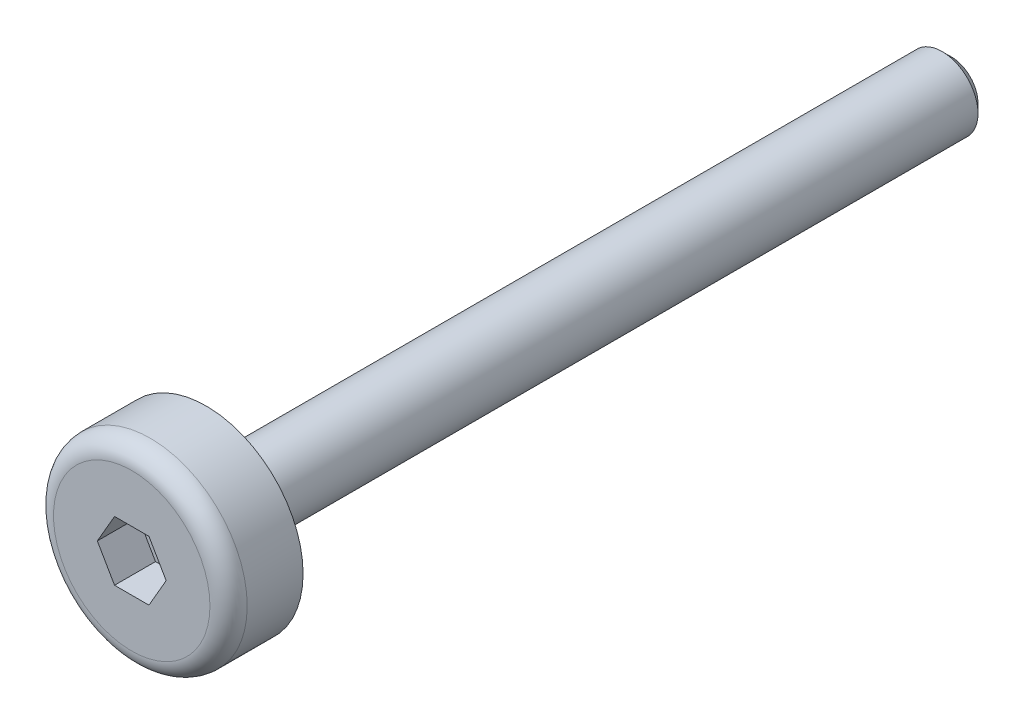
ISO-10303-21;
HEADER;
FILE_DESCRIPTION(('STEP AP214'),'2;1');
FILE_NAME('part.step','',(''),(''),'','','');
FILE_SCHEMA(('AUTOMOTIVE_DESIGN { 1 0 10303 214 1 1 1 1 }'));
ENDSEC;
DATA;
#1=APPLICATION_CONTEXT('core data for automotive mechanical design processes');
#2=APPLICATION_PROTOCOL_DEFINITION('international standard','automotive_design',2000,#1);
#3=PRODUCT_CONTEXT('',#1,'mechanical');
#4=PRODUCT('Part','Part','',(#3));
#5=PRODUCT_RELATED_PRODUCT_CATEGORY('part','',(#4));
#6=PRODUCT_DEFINITION_FORMATION('','',#4);
#7=PRODUCT_DEFINITION_CONTEXT('part definition',#1,'design');
#8=PRODUCT_DEFINITION('design','',#6,#7);
#9=PRODUCT_DEFINITION_SHAPE('','',#8);
#10=(LENGTH_UNIT() NAMED_UNIT(*) SI_UNIT(.MILLI.,.METRE.));
#11=(NAMED_UNIT(*) PLANE_ANGLE_UNIT() SI_UNIT($,.RADIAN.));
#12=(NAMED_UNIT(*) SI_UNIT($,.STERADIAN.) SOLID_ANGLE_UNIT());
#13=UNCERTAINTY_MEASURE_WITH_UNIT(LENGTH_MEASURE(1.E-05),#10,'distance_accuracy_value','');
#14=(GEOMETRIC_REPRESENTATION_CONTEXT(3) GLOBAL_UNCERTAINTY_ASSIGNED_CONTEXT((#13)) GLOBAL_UNIT_ASSIGNED_CONTEXT((#10,
#11,#12)) REPRESENTATION_CONTEXT('',''));
#15=CARTESIAN_POINT('',(0.,0.,0.));
#16=DIRECTION('',(0.,0.,1.));
#17=DIRECTION('',(1.,0.,0.));
#18=AXIS2_PLACEMENT_3D('',#15,#16,#17);
#19=CARTESIAN_POINT('',(0.,0.,-25.));
#20=DIRECTION('',(0.,0.,-1.));
#21=DIRECTION('',(-1.,0.,0.));
#22=AXIS2_PLACEMENT_3D('',#19,#20,#21);
#23=PLANE('',#22);
#24=CARTESIAN_POINT('',(0.,0.,-25.));
#25=DIRECTION('',(0.,0.,-1.));
#26=DIRECTION('',(-1.,0.,0.));
#27=AXIS2_PLACEMENT_3D('',#24,#25,#26);
#28=CIRCLE('',#27,0.900000000000008);
#29=CARTESIAN_POINT('',(-0.900000000000008,0.,-25.));
#30=VERTEX_POINT('',#29);
#31=EDGE_CURVE('E156',#30,#30,#28,.T.);
#32=ORIENTED_EDGE('',*,*,#31,.T.);
#33=EDGE_LOOP('',(#32));
#34=FACE_BOUND('',#33,.T.);
#35=ADVANCED_FACE('F40',(#34),#23,.T.);
#36=CARTESIAN_POINT('',(0.,0.,10.123));
#37=DIRECTION('',(0.,0.,1.));
#38=DIRECTION('',(1.,0.,0.));
#39=AXIS2_PLACEMENT_3D('',#36,#37,#38);
#40=CYLINDRICAL_SURFACE('',#39,1.2);
#41=CARTESIAN_POINT('',(0.,0.,-24.7));
#42=DIRECTION('',(0.,0.,-1.));
#43=DIRECTION('',(-1.,0.,0.));
#44=AXIS2_PLACEMENT_3D('',#41,#42,#43);
#45=CIRCLE('',#44,1.2);
#46=CARTESIAN_POINT('',(-1.2,0.,-24.7));
#47=VERTEX_POINT('',#46);
#48=EDGE_CURVE('E153',#47,#47,#45,.F.);
#49=ORIENTED_EDGE('',*,*,#48,.T.);
#50=EDGE_LOOP('',(#49));
#51=FACE_BOUND('',#50,.T.);
#52=CARTESIAN_POINT('',(0.,0.,0.));
#53=DIRECTION('',(0.,0.,1.));
#54=DIRECTION('',(1.,0.,0.));
#55=AXIS2_PLACEMENT_3D('',#52,#53,#54);
#56=CIRCLE('',#55,1.2);
#57=CARTESIAN_POINT('',(1.2,0.,0.));
#58=VERTEX_POINT('',#57);
#59=EDGE_CURVE('E150',#58,#58,#56,.T.);
#60=ORIENTED_EDGE('',*,*,#59,.F.);
#61=EDGE_LOOP('',(#60));
#62=FACE_BOUND('',#61,.T.);
#63=ADVANCED_FACE('F176',(#51,#62),#40,.T.);
#64=CARTESIAN_POINT('',(1.2,0.,0.));
#65=DIRECTION('',(0.,0.,-1.));
#66=DIRECTION('',(-1.,0.,0.));
#67=AXIS2_PLACEMENT_3D('',#64,#65,#66);
#68=PLANE('',#67);
#69=ORIENTED_EDGE('',*,*,#59,.T.);
#70=EDGE_LOOP('',(#69));
#71=FACE_BOUND('',#70,.T.);
#72=CARTESIAN_POINT('',(0.,0.,0.));
#73=DIRECTION('',(0.,0.,1.));
#74=DIRECTION('',(1.,0.,0.));
#75=AXIS2_PLACEMENT_3D('',#72,#73,#74);
#76=CIRCLE('',#75,3.25);
#77=CARTESIAN_POINT('',(3.25,0.,0.));
#78=VERTEX_POINT('',#77);
#79=EDGE_CURVE('E142',#78,#78,#76,.T.);
#80=ORIENTED_EDGE('',*,*,#79,.F.);
#81=EDGE_LOOP('',(#80));
#82=FACE_BOUND('',#81,.T.);
#83=ADVANCED_FACE('F182',(#71,#82),#68,.T.);
#84=CARTESIAN_POINT('',(0.,0.,10.123));
#85=DIRECTION('',(0.,0.,1.));
#86=DIRECTION('',(1.,0.,0.));
#87=AXIS2_PLACEMENT_3D('',#84,#85,#86);
#88=CYLINDRICAL_SURFACE('',#87,3.25);
#89=CARTESIAN_POINT('',(0.,0.,1.875));
#90=DIRECTION('',(0.,0.,1.));
#91=DIRECTION('',(1.,0.,0.));
#92=AXIS2_PLACEMENT_3D('',#89,#90,#91);
#93=CIRCLE('',#92,3.25);
#94=CARTESIAN_POINT('',(3.25,0.,1.875));
#95=VERTEX_POINT('',#94);
#96=EDGE_CURVE('E11',#95,#95,#93,.F.);
#97=ORIENTED_EDGE('',*,*,#96,.T.);
#98=EDGE_LOOP('',(#97));
#99=FACE_BOUND('',#98,.T.);
#100=ORIENTED_EDGE('',*,*,#79,.T.);
#101=EDGE_LOOP('',(#100));
#102=FACE_BOUND('',#101,.T.);
#103=ADVANCED_FACE('F191',(#99,#102),#88,.T.);
#104=CARTESIAN_POINT('',(3.25,0.,2.5));
#105=DIRECTION('',(0.,0.,1.));
#106=DIRECTION('',(1.,0.,0.));
#107=AXIS2_PLACEMENT_3D('',#104,#105,#106);
#108=PLANE('',#107);
#109=DIRECTION('',(0.499999999999995,0.866025403784441,0.));
#110=VECTOR('',#109,1.);
#111=CARTESIAN_POINT('',(0.577350269189637,-0.999999999999993,2.5));
#112=LINE('',#111,#110);
#113=CARTESIAN_POINT('',(0.577350269189637,-0.999999999999993,2.5));
#114=VERTEX_POINT('',#113);
#115=CARTESIAN_POINT('',(1.15470053837925,0.,2.5));
#116=VERTEX_POINT('',#115);
#117=EDGE_CURVE('E55',#114,#116,#112,.T.);
#118=ORIENTED_EDGE('',*,*,#117,.F.);
#119=DIRECTION('',(1.,0.,0.));
#120=VECTOR('',#119,1.);
#121=CARTESIAN_POINT('',(-0.577350269189617,-1.00000000000001,2.5));
#122=LINE('',#121,#120);
#123=CARTESIAN_POINT('',(-0.577350269189617,-1.00000000000001,2.5));
#124=VERTEX_POINT('',#123);
#125=EDGE_CURVE('E138',#124,#114,#122,.T.);
#126=ORIENTED_EDGE('',*,*,#125,.F.);
#127=DIRECTION('',(0.500000000000007,-0.866025403784434,0.));
#128=VECTOR('',#127,1.);
#129=CARTESIAN_POINT('',(-1.15470053837925,0.,2.5));
#130=LINE('',#129,#128);
#131=CARTESIAN_POINT('',(-1.15470053837925,0.,2.5));
#132=VERTEX_POINT('',#131);
#133=EDGE_CURVE('E136',#132,#124,#130,.T.);
#134=ORIENTED_EDGE('',*,*,#133,.F.);
#135=DIRECTION('',(-0.499999999999995,-0.866025403784442,0.));
#136=VECTOR('',#135,1.);
#137=CARTESIAN_POINT('',(-0.57735026918963,0.999999999999998,2.5));
#138=LINE('',#137,#136);
#139=CARTESIAN_POINT('',(-0.57735026918963,0.999999999999998,2.5));
#140=VERTEX_POINT('',#139);
#141=EDGE_CURVE('E103',#140,#132,#138,.T.);
#142=ORIENTED_EDGE('',*,*,#141,.F.);
#143=DIRECTION('',(-1.,0.,0.));
#144=VECTOR('',#143,1.);
#145=CARTESIAN_POINT('',(0.577350269189624,1.,2.5));
#146=LINE('',#145,#144);
#147=CARTESIAN_POINT('',(0.577350269189624,1.,2.5));
#148=VERTEX_POINT('',#147);
#149=EDGE_CURVE('E132',#148,#140,#146,.T.);
#150=ORIENTED_EDGE('',*,*,#149,.F.);
#151=DIRECTION('',(-0.500000000000001,0.866025403784438,0.));
#152=VECTOR('',#151,1.);
#153=CARTESIAN_POINT('',(1.15470053837925,0.,2.5));
#154=LINE('',#153,#152);
#155=EDGE_CURVE('E129',#116,#148,#154,.T.);
#156=ORIENTED_EDGE('',*,*,#155,.F.);
#157=EDGE_LOOP('',(#118,#126,#134,#142,#150,#156));
#158=FACE_BOUND('',#157,.T.);
#159=CARTESIAN_POINT('',(0.,0.,2.5));
#160=DIRECTION('',(0.,0.,1.));
#161=DIRECTION('',(1.,0.,0.));
#162=AXIS2_PLACEMENT_3D('',#159,#160,#161);
#163=CIRCLE('',#162,2.625);
#164=CARTESIAN_POINT('',(2.625,0.,2.5));
#165=VERTEX_POINT('',#164);
#166=EDGE_CURVE('E48',#165,#165,#163,.T.);
#167=ORIENTED_EDGE('',*,*,#166,.T.);
#168=EDGE_LOOP('',(#167));
#169=FACE_BOUND('',#168,.T.);
#170=ADVANCED_FACE('F161',(#158,#169),#108,.T.);
#171=CARTESIAN_POINT('',(0.,0.,-24.7));
#172=DIRECTION('',(0.,0.,1.));
#173=DIRECTION('',(1.,0.,0.));
#174=AXIS2_PLACEMENT_3D('',#171,#172,#173);
#175=CONICAL_SURFACE('',#174,1.2,0.785398163397443);
#176=ORIENTED_EDGE('',*,*,#31,.F.);
#177=EDGE_LOOP('',(#176));
#178=FACE_BOUND('',#177,.T.);
#179=ORIENTED_EDGE('',*,*,#48,.F.);
#180=EDGE_LOOP('',(#179));
#181=FACE_BOUND('',#180,.T.);
#182=ADVANCED_FACE('F165',(#178,#181),#175,.T.);
#183=CARTESIAN_POINT('',(0.,0.,1.875));
#184=DIRECTION('',(0.,0.,1.));
#185=DIRECTION('',(1.,0.,0.));
#186=AXIS2_PLACEMENT_3D('',#183,#184,#185);
#187=TOROIDAL_SURFACE('',#186,2.625,0.625);
#188=ORIENTED_EDGE('',*,*,#96,.F.);
#189=EDGE_LOOP('',(#188));
#190=FACE_BOUND('',#189,.T.);
#191=ORIENTED_EDGE('',*,*,#166,.F.);
#192=EDGE_LOOP('',(#191));
#193=FACE_BOUND('',#192,.T.);
#194=ADVANCED_FACE('F42',(#190,#193),#187,.T.);
#195=CARTESIAN_POINT('',(0.577350269189637,-0.999999999999993,1.125));
#196=DIRECTION('',(0.866025403784441,-0.499999999999995,0.));
#197=DIRECTION('',(0.499999999999995,0.866025403784441,0.));
#198=AXIS2_PLACEMENT_3D('',#195,#196,#197);
#199=PLANE('',#198);
#200=ORIENTED_EDGE('',*,*,#117,.T.);
#201=DIRECTION('',(0.,0.,1.));
#202=VECTOR('',#201,1.);
#203=CARTESIAN_POINT('',(1.15470053837925,0.,1.125));
#204=LINE('',#203,#202);
#205=CARTESIAN_POINT('',(1.15470053837925,0.,1.125));
#206=VERTEX_POINT('',#205);
#207=EDGE_CURVE('E85',#206,#116,#204,.T.);
#208=ORIENTED_EDGE('',*,*,#207,.F.);
#209=DIRECTION('',(0.499999999999995,0.866025403784441,0.));
#210=VECTOR('',#209,1.);
#211=CARTESIAN_POINT('',(0.577350269189637,-0.999999999999993,1.125));
#212=LINE('',#211,#210);
#213=CARTESIAN_POINT('',(0.577350269189637,-0.999999999999993,1.125));
#214=VERTEX_POINT('',#213);
#215=EDGE_CURVE('E140',#214,#206,#212,.T.);
#216=ORIENTED_EDGE('',*,*,#215,.F.);
#217=DIRECTION('',(0.,0.,1.));
#218=VECTOR('',#217,1.);
#219=CARTESIAN_POINT('',(0.577350269189637,-0.999999999999993,1.125));
#220=LINE('',#219,#218);
#221=EDGE_CURVE('E63',#214,#114,#220,.T.);
#222=ORIENTED_EDGE('',*,*,#221,.T.);
#223=EDGE_LOOP('',(#200,#208,#216,#222));
#224=FACE_BOUND('',#223,.T.);
#225=ADVANCED_FACE('F164',(#224),#199,.F.);
#226=CARTESIAN_POINT('',(-0.577350269189617,-1.00000000000001,1.125));
#227=DIRECTION('',(0.,-1.,0.));
#228=DIRECTION('',(1.,0.,0.));
#229=AXIS2_PLACEMENT_3D('',#226,#227,#228);
#230=PLANE('',#229);
#231=ORIENTED_EDGE('',*,*,#125,.T.);
#232=ORIENTED_EDGE('',*,*,#221,.F.);
#233=DIRECTION('',(1.,0.,0.));
#234=VECTOR('',#233,1.);
#235=CARTESIAN_POINT('',(-0.577350269189617,-1.00000000000001,1.125));
#236=LINE('',#235,#234);
#237=CARTESIAN_POINT('',(-0.577350269189617,-1.00000000000001,1.125));
#238=VERTEX_POINT('',#237);
#239=EDGE_CURVE('E115',#238,#214,#236,.T.);
#240=ORIENTED_EDGE('',*,*,#239,.F.);
#241=DIRECTION('',(0.,0.,1.));
#242=VECTOR('',#241,1.);
#243=CARTESIAN_POINT('',(-0.577350269189617,-1.00000000000001,1.125));
#244=LINE('',#243,#242);
#245=EDGE_CURVE('E107',#238,#124,#244,.T.);
#246=ORIENTED_EDGE('',*,*,#245,.T.);
#247=EDGE_LOOP('',(#231,#232,#240,#246));
#248=FACE_BOUND('',#247,.T.);
#249=ADVANCED_FACE('F171',(#248),#230,.F.);
#250=CARTESIAN_POINT('',(-1.15470053837925,0.,1.125));
#251=DIRECTION('',(-0.866025403784435,-0.500000000000007,0.));
#252=DIRECTION('',(0.500000000000007,-0.866025403784435,0.));
#253=AXIS2_PLACEMENT_3D('',#250,#251,#252);
#254=PLANE('',#253);
#255=ORIENTED_EDGE('',*,*,#133,.T.);
#256=ORIENTED_EDGE('',*,*,#245,.F.);
#257=DIRECTION('',(0.500000000000007,-0.866025403784434,0.));
#258=VECTOR('',#257,1.);
#259=CARTESIAN_POINT('',(-1.15470053837925,0.,1.125));
#260=LINE('',#259,#258);
#261=CARTESIAN_POINT('',(-1.15470053837925,0.,1.125));
#262=VERTEX_POINT('',#261);
#263=EDGE_CURVE('E111',#262,#238,#260,.T.);
#264=ORIENTED_EDGE('',*,*,#263,.F.);
#265=DIRECTION('',(0.,0.,1.));
#266=VECTOR('',#265,1.);
#267=CARTESIAN_POINT('',(-1.15470053837925,0.,1.125));
#268=LINE('',#267,#266);
#269=EDGE_CURVE('E96',#262,#132,#268,.T.);
#270=ORIENTED_EDGE('',*,*,#269,.T.);
#271=EDGE_LOOP('',(#255,#256,#264,#270));
#272=FACE_BOUND('',#271,.T.);
#273=ADVANCED_FACE('F112',(#272),#254,.F.);
#274=CARTESIAN_POINT('',(-0.57735026918963,0.999999999999998,1.125));
#275=DIRECTION('',(-0.866025403784442,0.499999999999995,0.));
#276=DIRECTION('',(-0.499999999999995,-0.866025403784441,0.));
#277=AXIS2_PLACEMENT_3D('',#274,#275,#276);
#278=PLANE('',#277);
#279=ORIENTED_EDGE('',*,*,#141,.T.);
#280=ORIENTED_EDGE('',*,*,#269,.F.);
#281=DIRECTION('',(-0.499999999999995,-0.866025403784442,0.));
#282=VECTOR('',#281,1.);
#283=CARTESIAN_POINT('',(-0.57735026918963,0.999999999999998,1.125));
#284=LINE('',#283,#282);
#285=CARTESIAN_POINT('',(-0.57735026918963,0.999999999999998,1.125));
#286=VERTEX_POINT('',#285);
#287=EDGE_CURVE('E100',#286,#262,#284,.T.);
#288=ORIENTED_EDGE('',*,*,#287,.F.);
#289=DIRECTION('',(0.,0.,1.));
#290=VECTOR('',#289,1.);
#291=CARTESIAN_POINT('',(-0.57735026918963,0.999999999999998,1.125));
#292=LINE('',#291,#290);
#293=EDGE_CURVE('E108',#286,#140,#292,.T.);
#294=ORIENTED_EDGE('',*,*,#293,.T.);
#295=EDGE_LOOP('',(#279,#280,#288,#294));
#296=FACE_BOUND('',#295,.T.);
#297=ADVANCED_FACE('F98',(#296),#278,.F.);
#298=CARTESIAN_POINT('',(0.577350269189624,1.,1.125));
#299=DIRECTION('',(0.,1.,0.));
#300=DIRECTION('',(-1.,0.,0.));
#301=AXIS2_PLACEMENT_3D('',#298,#299,#300);
#302=PLANE('',#301);
#303=ORIENTED_EDGE('',*,*,#149,.T.);
#304=ORIENTED_EDGE('',*,*,#293,.F.);
#305=DIRECTION('',(-1.,0.,0.));
#306=VECTOR('',#305,1.);
#307=CARTESIAN_POINT('',(0.577350269189624,1.,1.125));
#308=LINE('',#307,#306);
#309=CARTESIAN_POINT('',(0.577350269189624,1.,1.125));
#310=VERTEX_POINT('',#309);
#311=EDGE_CURVE('E121',#310,#286,#308,.T.);
#312=ORIENTED_EDGE('',*,*,#311,.F.);
#313=DIRECTION('',(0.,0.,1.));
#314=VECTOR('',#313,1.);
#315=CARTESIAN_POINT('',(0.577350269189624,1.,1.125));
#316=LINE('',#315,#314);
#317=EDGE_CURVE('E145',#310,#148,#316,.T.);
#318=ORIENTED_EDGE('',*,*,#317,.T.);
#319=EDGE_LOOP('',(#303,#304,#312,#318));
#320=FACE_BOUND('',#319,.T.);
#321=ADVANCED_FACE('F202',(#320),#302,.F.);
#322=CARTESIAN_POINT('',(1.15470053837925,0.,1.125));
#323=DIRECTION('',(0.866025403784438,0.500000000000001,0.));
#324=DIRECTION('',(-0.500000000000001,0.866025403784438,0.));
#325=AXIS2_PLACEMENT_3D('',#322,#323,#324);
#326=PLANE('',#325);
#327=ORIENTED_EDGE('',*,*,#155,.T.);
#328=ORIENTED_EDGE('',*,*,#317,.F.);
#329=DIRECTION('',(-0.500000000000001,0.866025403784438,0.));
#330=VECTOR('',#329,1.);
#331=CARTESIAN_POINT('',(1.15470053837925,0.,1.125));
#332=LINE('',#331,#330);
#333=EDGE_CURVE('E123',#206,#310,#332,.T.);
#334=ORIENTED_EDGE('',*,*,#333,.F.);
#335=ORIENTED_EDGE('',*,*,#207,.T.);
#336=EDGE_LOOP('',(#327,#328,#334,#335));
#337=FACE_BOUND('',#336,.T.);
#338=ADVANCED_FACE('F199',(#337),#326,.F.);
#339=CARTESIAN_POINT('',(0.,0.,1.125));
#340=DIRECTION('',(0.,0.,1.));
#341=DIRECTION('',(1.,0.,0.));
#342=AXIS2_PLACEMENT_3D('',#339,#340,#341);
#343=PLANE('',#342);
#344=ORIENTED_EDGE('',*,*,#215,.T.);
#345=ORIENTED_EDGE('',*,*,#333,.T.);
#346=ORIENTED_EDGE('',*,*,#311,.T.);
#347=ORIENTED_EDGE('',*,*,#287,.T.);
#348=ORIENTED_EDGE('',*,*,#263,.T.);
#349=ORIENTED_EDGE('',*,*,#239,.T.);
#350=EDGE_LOOP('',(#344,#345,#346,#347,#348,#349));
#351=FACE_BOUND('',#350,.T.);
#352=ADVANCED_FACE('F118',(#351),#343,.T.);
#353=CLOSED_SHELL('',(#35,#63,#83,#103,#170,#182,#194,#225,#249,#273,#297,#321,#338,#352));
#354=MANIFOLD_SOLID_BREP('B2',#353);
#355=ADVANCED_BREP_SHAPE_REPRESENTATION('',(#18,#354),#14);
#356=SHAPE_DEFINITION_REPRESENTATION(#9,#355);
ENDSEC;
END-ISO-10303-21;
